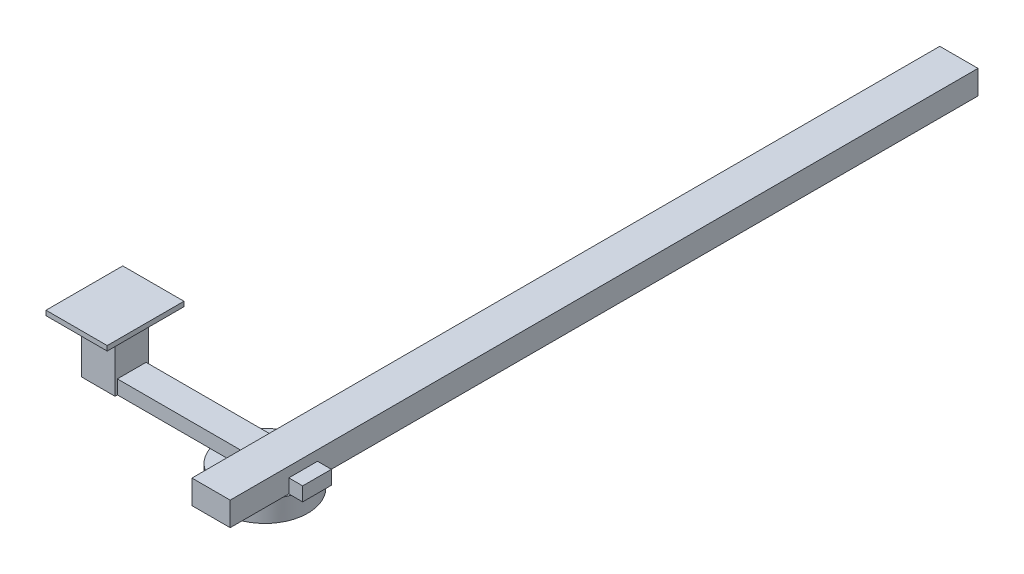
ISO-10303-21;
HEADER;
FILE_DESCRIPTION(('STEP AP214'),'2;1');
FILE_NAME('part.step','',(''),(''),'','','');
FILE_SCHEMA(('AUTOMOTIVE_DESIGN { 1 0 10303 214 1 1 1 1 }'));
ENDSEC;
DATA;
#1=APPLICATION_CONTEXT('core data for automotive mechanical design processes');
#2=APPLICATION_PROTOCOL_DEFINITION('international standard','automotive_design',2000,#1);
#3=PRODUCT_CONTEXT('',#1,'mechanical');
#4=PRODUCT('Part','Part','',(#3));
#5=PRODUCT_RELATED_PRODUCT_CATEGORY('part','',(#4));
#6=PRODUCT_DEFINITION_FORMATION('','',#4);
#7=PRODUCT_DEFINITION_CONTEXT('part definition',#1,'design');
#8=PRODUCT_DEFINITION('design','',#6,#7);
#9=PRODUCT_DEFINITION_SHAPE('','',#8);
#10=(LENGTH_UNIT() NAMED_UNIT(*) SI_UNIT(.MILLI.,.METRE.));
#11=(NAMED_UNIT(*) PLANE_ANGLE_UNIT() SI_UNIT($,.RADIAN.));
#12=(NAMED_UNIT(*) SI_UNIT($,.STERADIAN.) SOLID_ANGLE_UNIT());
#13=UNCERTAINTY_MEASURE_WITH_UNIT(LENGTH_MEASURE(1.E-05),#10,'distance_accuracy_value','');
#14=(GEOMETRIC_REPRESENTATION_CONTEXT(3) GLOBAL_UNCERTAINTY_ASSIGNED_CONTEXT((#13)) GLOBAL_UNIT_ASSIGNED_CONTEXT((#10,
#11,#12)) REPRESENTATION_CONTEXT('',''));
#15=CARTESIAN_POINT('',(0.,0.,0.));
#16=DIRECTION('',(0.,0.,1.));
#17=DIRECTION('',(1.,0.,0.));
#18=AXIS2_PLACEMENT_3D('',#15,#16,#17);
#19=CARTESIAN_POINT('',(0.,74.,0.));
#20=DIRECTION('',(0.,1.,0.));
#21=DIRECTION('',(-1.,0.,0.));
#22=AXIS2_PLACEMENT_3D('',#19,#20,#21);
#23=PLANE('',#22);
#24=DIRECTION('',(-1.,0.,0.));
#25=VECTOR('',#24,1.);
#26=CARTESIAN_POINT('',(-278.5,73.9999999999999,-30.));
#27=LINE('',#26,#25);
#28=CARTESIAN_POINT('',(0.,74.,-30.));
#29=VERTEX_POINT('',#28);
#30=CARTESIAN_POINT('',(-278.5,73.9999999999999,-30.));
#31=VERTEX_POINT('',#30);
#32=EDGE_CURVE('E305',#29,#31,#27,.T.);
#33=ORIENTED_EDGE('',*,*,#32,.T.);
#34=DIRECTION('',(0.,0.,1.));
#35=VECTOR('',#34,1.);
#36=CARTESIAN_POINT('',(-278.5,73.9999999999999,0.));
#37=LINE('',#36,#35);
#38=CARTESIAN_POINT('',(-278.5,73.9999999999999,30.));
#39=VERTEX_POINT('',#38);
#40=EDGE_CURVE('E11',#31,#39,#37,.T.);
#41=ORIENTED_EDGE('',*,*,#40,.T.);
#42=DIRECTION('',(1.,0.,0.));
#43=VECTOR('',#42,1.);
#44=CARTESIAN_POINT('',(-278.5,73.9999999999999,30.));
#45=LINE('',#44,#43);
#46=CARTESIAN_POINT('',(0.,74.,30.));
#47=VERTEX_POINT('',#46);
#48=EDGE_CURVE('E297',#39,#47,#45,.T.);
#49=ORIENTED_EDGE('',*,*,#48,.T.);
#50=DIRECTION('',(0.,0.,-1.));
#51=VECTOR('',#50,1.);
#52=CARTESIAN_POINT('',(0.,74.,-30.));
#53=LINE('',#52,#51);
#54=EDGE_CURVE('E301',#47,#29,#53,.T.);
#55=ORIENTED_EDGE('',*,*,#54,.T.);
#56=EDGE_LOOP('',(#33,#41,#49,#55));
#57=FACE_BOUND('',#56,.T.);
#58=ADVANCED_FACE('F39',(#57),#23,.T.);
#59=CARTESIAN_POINT('',(90.,45.,0.));
#60=DIRECTION('',(0.,-1.,0.));
#61=DIRECTION('',(1.,0.,0.));
#62=AXIS2_PLACEMENT_3D('',#59,#60,#61);
#63=PLANE('',#62);
#64=DIRECTION('',(-1.,0.,0.));
#65=VECTOR('',#64,1.);
#66=CARTESIAN_POINT('',(108.950738565978,45.,30.));
#67=LINE('',#66,#65);
#68=CARTESIAN_POINT('',(84.8528137423857,45.,30.));
#69=VERTEX_POINT('',#68);
#70=CARTESIAN_POINT('',(79.9507385659778,45.,30.));
#71=VERTEX_POINT('',#70);
#72=EDGE_CURVE('E289',#69,#71,#67,.T.);
#73=ORIENTED_EDGE('',*,*,#72,.T.);
#74=DIRECTION('',(0.,0.,-1.));
#75=VECTOR('',#74,1.);
#76=CARTESIAN_POINT('',(79.9507385659778,45.,-1411.12420449083));
#77=LINE('',#76,#75);
#78=CARTESIAN_POINT('',(79.9507385659778,45.,41.3264975863509));
#79=VERTEX_POINT('',#78);
#80=EDGE_CURVE('E396',#79,#71,#77,.T.);
#81=ORIENTED_EDGE('',*,*,#80,.F.);
#82=CARTESIAN_POINT('',(0.,45.,0.));
#83=DIRECTION('',(0.,1.,0.));
#84=DIRECTION('',(-1.,0.,0.));
#85=AXIS2_PLACEMENT_3D('',#82,#83,#84);
#86=CIRCLE('',#85,90.);
#87=EDGE_CURVE('E419',#79,#69,#86,.T.);
#88=ORIENTED_EDGE('',*,*,#87,.T.);
#89=EDGE_LOOP('',(#73,#81,#88));
#90=FACE_BOUND('',#89,.T.);
#91=ADVANCED_FACE('F501',(#90),#63,.F.);
#92=DIRECTION('',(-1.,0.,0.));
#93=VECTOR('',#92,1.);
#94=CARTESIAN_POINT('',(108.950738565978,45.,-30.));
#95=LINE('',#94,#93);
#96=CARTESIAN_POINT('',(84.8528137423857,45.,-30.));
#97=VERTEX_POINT('',#96);
#98=CARTESIAN_POINT('',(79.9507385659778,45.,-30.));
#99=VERTEX_POINT('',#98);
#100=EDGE_CURVE('E55',#97,#99,#95,.T.);
#101=ORIENTED_EDGE('',*,*,#100,.F.);
#102=CARTESIAN_POINT('',(79.9507385659778,45.,-41.3264975863508));
#103=VERTEX_POINT('',#102);
#104=EDGE_CURVE('E420',#97,#103,#86,.T.);
#105=ORIENTED_EDGE('',*,*,#104,.T.);
#106=EDGE_CURVE('E395',#99,#103,#77,.T.);
#107=ORIENTED_EDGE('',*,*,#106,.F.);
#108=EDGE_LOOP('',(#101,#105,#107));
#109=FACE_BOUND('',#108,.T.);
#110=ADVANCED_FACE('F527',(#109),#63,.F.);
#111=CARTESIAN_POINT('',(79.9507385659778,95.,-1411.12420449083));
#112=DIRECTION('',(-1.,0.,0.));
#113=DIRECTION('',(0.,-1.,0.));
#114=AXIS2_PLACEMENT_3D('',#111,#112,#113);
#115=PLANE('',#114);
#116=DIRECTION('',(0.,-1.,0.));
#117=VECTOR('',#116,1.);
#118=CARTESIAN_POINT('',(79.9507385659778,74.,30.));
#119=LINE('',#118,#117);
#120=CARTESIAN_POINT('',(79.9507385659778,74.,30.));
#121=VERTEX_POINT('',#120);
#122=EDGE_CURVE('E252',#121,#71,#119,.T.);
#123=ORIENTED_EDGE('',*,*,#122,.F.);
#124=DIRECTION('',(0.,0.,1.));
#125=VECTOR('',#124,1.);
#126=CARTESIAN_POINT('',(79.9507385659778,74.,30.));
#127=LINE('',#126,#125);
#128=CARTESIAN_POINT('',(79.9507385659778,74.,-30.));
#129=VERTEX_POINT('',#128);
#130=EDGE_CURVE('E258',#129,#121,#127,.T.);
#131=ORIENTED_EDGE('',*,*,#130,.F.);
#132=DIRECTION('',(0.,1.,0.));
#133=VECTOR('',#132,1.);
#134=CARTESIAN_POINT('',(79.9507385659778,74.,-30.));
#135=LINE('',#134,#133);
#136=EDGE_CURVE('E271',#99,#129,#135,.T.);
#137=ORIENTED_EDGE('',*,*,#136,.F.);
#138=ORIENTED_EDGE('',*,*,#106,.T.);
#139=CARTESIAN_POINT('',(79.9507385659778,45.,-1411.12420449083));
#140=VERTEX_POINT('',#139);
#141=EDGE_CURVE('E390',#103,#140,#77,.T.);
#142=ORIENTED_EDGE('',*,*,#141,.T.);
#143=DIRECTION('',(0.,-1.,0.));
#144=VECTOR('',#143,1.);
#145=CARTESIAN_POINT('',(79.9507385659778,95.,-1411.12420449083));
#146=LINE('',#145,#144);
#147=CARTESIAN_POINT('',(79.9507385659778,95.,-1411.12420449083));
#148=VERTEX_POINT('',#147);
#149=EDGE_CURVE('E402',#148,#140,#146,.T.);
#150=ORIENTED_EDGE('',*,*,#149,.F.);
#151=DIRECTION('',(0.,0.,-1.));
#152=VECTOR('',#151,1.);
#153=CARTESIAN_POINT('',(79.9507385659778,95.,-1411.12420449083));
#154=LINE('',#153,#152);
#155=CARTESIAN_POINT('',(79.9507385659778,95.,152.582043319577));
#156=VERTEX_POINT('',#155);
#157=EDGE_CURVE('E375',#156,#148,#154,.T.);
#158=ORIENTED_EDGE('',*,*,#157,.F.);
#159=DIRECTION('',(0.,-1.,0.));
#160=VECTOR('',#159,1.);
#161=CARTESIAN_POINT('',(79.9507385659778,95.,152.582043319577));
#162=LINE('',#161,#160);
#163=CARTESIAN_POINT('',(79.9507385659778,45.,152.582043319577));
#164=VERTEX_POINT('',#163);
#165=EDGE_CURVE('E406',#156,#164,#162,.T.);
#166=ORIENTED_EDGE('',*,*,#165,.T.);
#167=EDGE_CURVE('E391',#164,#79,#77,.T.);
#168=ORIENTED_EDGE('',*,*,#167,.T.);
#169=ORIENTED_EDGE('',*,*,#80,.T.);
#170=EDGE_LOOP('',(#123,#131,#137,#138,#142,#150,#158,#166,#168,#169));
#171=FACE_BOUND('',#170,.T.);
#172=ADVANCED_FACE('F434',(#171),#115,.F.);
#173=DIRECTION('',(1.,0.,0.));
#174=VECTOR('',#173,1.);
#175=CARTESIAN_POINT('',(-278.5,44.9999999999999,30.));
#176=LINE('',#175,#174);
#177=CARTESIAN_POINT('',(-84.8528137423857,45.,30.));
#178=VERTEX_POINT('',#177);
#179=CARTESIAN_POINT('',(0.,45.,30.));
#180=VERTEX_POINT('',#179);
#181=EDGE_CURVE('E317',#178,#180,#176,.T.);
#182=ORIENTED_EDGE('',*,*,#181,.F.);
#183=CARTESIAN_POINT('',(0.,45.,90.));
#184=VERTEX_POINT('',#183);
#185=EDGE_CURVE('E414',#178,#184,#86,.T.);
#186=ORIENTED_EDGE('',*,*,#185,.T.);
#187=DIRECTION('',(0.,0.,1.));
#188=VECTOR('',#187,1.);
#189=CARTESIAN_POINT('',(0.,45.,-1411.12420449083));
#190=LINE('',#189,#188);
#191=EDGE_CURVE('E387',#180,#184,#190,.T.);
#192=ORIENTED_EDGE('',*,*,#191,.F.);
#193=EDGE_LOOP('',(#182,#186,#192));
#194=FACE_BOUND('',#193,.T.);
#195=ADVANCED_FACE('F481',(#194),#63,.F.);
#196=DIRECTION('',(-1.,0.,0.));
#197=VECTOR('',#196,1.);
#198=CARTESIAN_POINT('',(-278.5,44.9999999999999,-30.));
#199=LINE('',#198,#197);
#200=CARTESIAN_POINT('',(0.,45.,-30.));
#201=VERTEX_POINT('',#200);
#202=CARTESIAN_POINT('',(-84.8528137423857,45.,-30.));
#203=VERTEX_POINT('',#202);
#204=EDGE_CURVE('E323',#201,#203,#199,.T.);
#205=ORIENTED_EDGE('',*,*,#204,.F.);
#206=CARTESIAN_POINT('',(0.,45.,-90.));
#207=VERTEX_POINT('',#206);
#208=EDGE_CURVE('E48',#207,#201,#190,.T.);
#209=ORIENTED_EDGE('',*,*,#208,.F.);
#210=EDGE_CURVE('E470',#207,#203,#86,.T.);
#211=ORIENTED_EDGE('',*,*,#210,.T.);
#212=EDGE_LOOP('',(#205,#209,#211));
#213=FACE_BOUND('',#212,.T.);
#214=ADVANCED_FACE('F571',(#213),#63,.F.);
#215=CARTESIAN_POINT('',(0.,95.,-1411.12420449083));
#216=DIRECTION('',(1.,0.,0.));
#217=DIRECTION('',(0.,1.,0.));
#218=AXIS2_PLACEMENT_3D('',#215,#216,#217);
#219=PLANE('',#218);
#220=DIRECTION('',(0.,-1.,0.));
#221=VECTOR('',#220,1.);
#222=CARTESIAN_POINT('',(0.,74.,30.));
#223=LINE('',#222,#221);
#224=EDGE_CURVE('E347',#47,#180,#223,.T.);
#225=ORIENTED_EDGE('',*,*,#224,.T.);
#226=ORIENTED_EDGE('',*,*,#191,.T.);
#227=CARTESIAN_POINT('',(0.,45.,152.582043319577));
#228=VERTEX_POINT('',#227);
#229=EDGE_CURVE('E366',#184,#228,#190,.T.);
#230=ORIENTED_EDGE('',*,*,#229,.T.);
#231=DIRECTION('',(0.,-1.,0.));
#232=VECTOR('',#231,1.);
#233=CARTESIAN_POINT('',(0.,95.,152.582043319577));
#234=LINE('',#233,#232);
#235=CARTESIAN_POINT('',(0.,95.,152.582043319577));
#236=VERTEX_POINT('',#235);
#237=EDGE_CURVE('E410',#236,#228,#234,.T.);
#238=ORIENTED_EDGE('',*,*,#237,.F.);
#239=DIRECTION('',(0.,0.,1.));
#240=VECTOR('',#239,1.);
#241=CARTESIAN_POINT('',(0.,95.,-1411.12420449083));
#242=LINE('',#241,#240);
#243=CARTESIAN_POINT('',(0.,95.,-1411.12420449083));
#244=VERTEX_POINT('',#243);
#245=EDGE_CURVE('E367',#244,#236,#242,.T.);
#246=ORIENTED_EDGE('',*,*,#245,.F.);
#247=DIRECTION('',(0.,-1.,0.));
#248=VECTOR('',#247,1.);
#249=CARTESIAN_POINT('',(0.,95.,-1411.12420449083));
#250=LINE('',#249,#248);
#251=CARTESIAN_POINT('',(0.,45.,-1411.12420449083));
#252=VERTEX_POINT('',#251);
#253=EDGE_CURVE('E381',#244,#252,#250,.T.);
#254=ORIENTED_EDGE('',*,*,#253,.T.);
#255=EDGE_CURVE('E382',#252,#207,#190,.T.);
#256=ORIENTED_EDGE('',*,*,#255,.T.);
#257=ORIENTED_EDGE('',*,*,#208,.T.);
#258=DIRECTION('',(0.,-1.,0.));
#259=VECTOR('',#258,1.);
#260=CARTESIAN_POINT('',(0.,74.,-30.));
#261=LINE('',#260,#259);
#262=EDGE_CURVE('E344',#29,#201,#261,.T.);
#263=ORIENTED_EDGE('',*,*,#262,.F.);
#264=ORIENTED_EDGE('',*,*,#54,.F.);
#265=EDGE_LOOP('',(#225,#226,#230,#238,#246,#254,#256,#257,#263,#264));
#266=FACE_BOUND('',#265,.T.);
#267=ADVANCED_FACE('F448',(#266),#219,.F.);
#268=CARTESIAN_POINT('',(0.,0.,0.));
#269=DIRECTION('',(0.,1.,0.));
#270=DIRECTION('',(-1.,0.,0.));
#271=AXIS2_PLACEMENT_3D('',#268,#269,#270);
#272=PLANE('',#271);
#273=CARTESIAN_POINT('',(0.,0.,0.));
#274=DIRECTION('',(0.,1.,0.));
#275=DIRECTION('',(-1.,0.,0.));
#276=AXIS2_PLACEMENT_3D('',#273,#274,#275);
#277=CIRCLE('',#276,90.);
#278=CARTESIAN_POINT('',(-90.,0.,0.));
#279=VERTEX_POINT('',#278);
#280=EDGE_CURVE('E418',#279,#279,#277,.T.);
#281=ORIENTED_EDGE('',*,*,#280,.F.);
#282=EDGE_LOOP('',(#281));
#283=FACE_BOUND('',#282,.T.);
#284=ADVANCED_FACE('F41',(#283),#272,.F.);
#285=CARTESIAN_POINT('',(0.,45.,0.));
#286=DIRECTION('',(0.,1.,0.));
#287=DIRECTION('',(-1.,0.,0.));
#288=AXIS2_PLACEMENT_3D('',#285,#286,#287);
#289=CYLINDRICAL_SURFACE('',#288,90.);
#290=EDGE_CURVE('E415',#184,#79,#86,.T.);
#291=ORIENTED_EDGE('',*,*,#290,.F.);
#292=ORIENTED_EDGE('',*,*,#185,.F.);
#293=CARTESIAN_POINT('',(0.,45.,0.));
#294=DIRECTION('',(0.,1.,0.));
#295=DIRECTION('',(-1.,0.,0.));
#296=AXIS2_PLACEMENT_3D('',#293,#294,#295);
#297=CIRCLE('',#296,90.);
#298=EDGE_CURVE('E363',#203,#178,#297,.T.);
#299=ORIENTED_EDGE('',*,*,#298,.F.);
#300=ORIENTED_EDGE('',*,*,#210,.F.);
#301=EDGE_CURVE('E445',#103,#207,#86,.T.);
#302=ORIENTED_EDGE('',*,*,#301,.F.);
#303=ORIENTED_EDGE('',*,*,#104,.F.);
#304=CARTESIAN_POINT('',(0.,45.,0.));
#305=DIRECTION('',(0.,1.,0.));
#306=DIRECTION('',(-1.,0.,0.));
#307=AXIS2_PLACEMENT_3D('',#304,#305,#306);
#308=CIRCLE('',#307,90.);
#309=EDGE_CURVE('E62',#69,#97,#308,.T.);
#310=ORIENTED_EDGE('',*,*,#309,.F.);
#311=ORIENTED_EDGE('',*,*,#87,.F.);
#312=EDGE_LOOP('',(#291,#292,#299,#300,#302,#303,#310,#311));
#313=FACE_BOUND('',#312,.T.);
#314=ORIENTED_EDGE('',*,*,#280,.T.);
#315=EDGE_LOOP('',(#314));
#316=FACE_BOUND('',#315,.T.);
#317=ADVANCED_FACE('F463',(#313,#316),#289,.T.);
#318=CARTESIAN_POINT('',(0.,45.,0.));
#319=DIRECTION('',(0.,1.,0.));
#320=DIRECTION('',(-1.,0.,0.));
#321=AXIS2_PLACEMENT_3D('',#318,#319,#320);
#322=PLANE('',#321);
#323=ORIENTED_EDGE('',*,*,#229,.F.);
#324=ORIENTED_EDGE('',*,*,#290,.T.);
#325=ORIENTED_EDGE('',*,*,#167,.F.);
#326=DIRECTION('',(1.,0.,0.));
#327=VECTOR('',#326,1.);
#328=CARTESIAN_POINT('',(0.,45.,152.582043319577));
#329=LINE('',#328,#327);
#330=EDGE_CURVE('E386',#228,#164,#329,.T.);
#331=ORIENTED_EDGE('',*,*,#330,.F.);
#332=EDGE_LOOP('',(#323,#324,#325,#331));
#333=FACE_BOUND('',#332,.T.);
#334=ADVANCED_FACE('F460',(#333),#322,.F.);
#335=ORIENTED_EDGE('',*,*,#141,.F.);
#336=ORIENTED_EDGE('',*,*,#301,.T.);
#337=ORIENTED_EDGE('',*,*,#255,.F.);
#338=DIRECTION('',(-1.,0.,0.));
#339=VECTOR('',#338,1.);
#340=CARTESIAN_POINT('',(0.,45.,-1411.12420449083));
#341=LINE('',#340,#339);
#342=EDGE_CURVE('E372',#140,#252,#341,.T.);
#343=ORIENTED_EDGE('',*,*,#342,.F.);
#344=EDGE_LOOP('',(#335,#336,#337,#343));
#345=FACE_BOUND('',#344,.T.);
#346=ADVANCED_FACE('F444',(#345),#322,.F.);
#347=CARTESIAN_POINT('',(0.,95.,152.582043319577));
#348=DIRECTION('',(0.,0.,-1.));
#349=DIRECTION('',(-1.,0.,0.));
#350=AXIS2_PLACEMENT_3D('',#347,#348,#349);
#351=PLANE('',#350);
#352=ORIENTED_EDGE('',*,*,#330,.T.);
#353=ORIENTED_EDGE('',*,*,#165,.F.);
#354=DIRECTION('',(1.,0.,0.));
#355=VECTOR('',#354,1.);
#356=CARTESIAN_POINT('',(0.,95.,152.582043319577));
#357=LINE('',#356,#355);
#358=EDGE_CURVE('E371',#236,#156,#357,.T.);
#359=ORIENTED_EDGE('',*,*,#358,.F.);
#360=ORIENTED_EDGE('',*,*,#237,.T.);
#361=EDGE_LOOP('',(#352,#353,#359,#360));
#362=FACE_BOUND('',#361,.T.);
#363=ADVANCED_FACE('F566',(#362),#351,.F.);
#364=CARTESIAN_POINT('',(0.,95.,-1411.12420449083));
#365=DIRECTION('',(0.,0.,1.));
#366=DIRECTION('',(1.,0.,0.));
#367=AXIS2_PLACEMENT_3D('',#364,#365,#366);
#368=PLANE('',#367);
#369=ORIENTED_EDGE('',*,*,#342,.T.);
#370=ORIENTED_EDGE('',*,*,#253,.F.);
#371=DIRECTION('',(-1.,0.,0.));
#372=VECTOR('',#371,1.);
#373=CARTESIAN_POINT('',(0.,95.,-1411.12420449083));
#374=LINE('',#373,#372);
#375=EDGE_CURVE('E378',#148,#244,#374,.T.);
#376=ORIENTED_EDGE('',*,*,#375,.F.);
#377=ORIENTED_EDGE('',*,*,#149,.T.);
#378=EDGE_LOOP('',(#369,#370,#376,#377));
#379=FACE_BOUND('',#378,.T.);
#380=ADVANCED_FACE('F441',(#379),#368,.F.);
#381=CARTESIAN_POINT('',(0.,95.,0.));
#382=DIRECTION('',(0.,1.,0.));
#383=DIRECTION('',(-1.,0.,0.));
#384=AXIS2_PLACEMENT_3D('',#381,#382,#383);
#385=PLANE('',#384);
#386=ORIENTED_EDGE('',*,*,#245,.T.);
#387=ORIENTED_EDGE('',*,*,#358,.T.);
#388=ORIENTED_EDGE('',*,*,#157,.T.);
#389=ORIENTED_EDGE('',*,*,#375,.T.);
#390=EDGE_LOOP('',(#386,#387,#388,#389));
#391=FACE_BOUND('',#390,.T.);
#392=ADVANCED_FACE('F453',(#391),#385,.T.);
#393=CARTESIAN_POINT('',(0.,45.,0.));
#394=DIRECTION('',(0.,1.,0.));
#395=DIRECTION('',(-1.,0.,0.));
#396=AXIS2_PLACEMENT_3D('',#393,#394,#395);
#397=PLANE('',#396);
#398=CARTESIAN_POINT('',(-278.5,44.9999999999999,-30.));
#399=VERTEX_POINT('',#398);
#400=EDGE_CURVE('E322',#203,#399,#199,.T.);
#401=ORIENTED_EDGE('',*,*,#400,.F.);
#402=ORIENTED_EDGE('',*,*,#298,.T.);
#403=CARTESIAN_POINT('',(-278.5,44.9999999999999,30.));
#404=VERTEX_POINT('',#403);
#405=EDGE_CURVE('E318',#404,#178,#176,.T.);
#406=ORIENTED_EDGE('',*,*,#405,.F.);
#407=DIRECTION('',(0.,0.,-1.));
#408=VECTOR('',#407,1.);
#409=CARTESIAN_POINT('',(-278.5,44.9999999999999,35.));
#410=LINE('',#409,#408);
#411=CARTESIAN_POINT('',(-278.5,44.9999999999999,35.));
#412=VERTEX_POINT('',#411);
#413=EDGE_CURVE('E314',#412,#404,#410,.T.);
#414=ORIENTED_EDGE('',*,*,#413,.F.);
#415=DIRECTION('',(1.,0.,0.));
#416=VECTOR('',#415,1.);
#417=CARTESIAN_POINT('',(-348.5,44.9999999999999,35.));
#418=LINE('',#417,#416);
#419=CARTESIAN_POINT('',(-348.5,44.9999999999999,35.));
#420=VERTEX_POINT('',#419);
#421=EDGE_CURVE('E311',#420,#412,#418,.T.);
#422=ORIENTED_EDGE('',*,*,#421,.F.);
#423=DIRECTION('',(0.,0.,1.));
#424=VECTOR('',#423,1.);
#425=CARTESIAN_POINT('',(-348.5,44.9999999999999,30.));
#426=LINE('',#425,#424);
#427=CARTESIAN_POINT('',(-348.5,44.9999999999999,-35.));
#428=VERTEX_POINT('',#427);
#429=EDGE_CURVE('E296',#428,#420,#426,.T.);
#430=ORIENTED_EDGE('',*,*,#429,.F.);
#431=DIRECTION('',(-1.,0.,0.));
#432=VECTOR('',#431,1.);
#433=CARTESIAN_POINT('',(-348.5,44.9999999999999,-35.));
#434=LINE('',#433,#432);
#435=CARTESIAN_POINT('',(-278.5,44.9999999999999,-35.));
#436=VERTEX_POINT('',#435);
#437=EDGE_CURVE('E302',#436,#428,#434,.T.);
#438=ORIENTED_EDGE('',*,*,#437,.F.);
#439=DIRECTION('',(0.,0.,-1.));
#440=VECTOR('',#439,1.);
#441=CARTESIAN_POINT('',(-278.5,44.9999999999999,-35.));
#442=LINE('',#441,#440);
#443=EDGE_CURVE('E327',#399,#436,#442,.T.);
#444=ORIENTED_EDGE('',*,*,#443,.F.);
#445=EDGE_LOOP('',(#401,#402,#406,#414,#422,#430,#438,#444));
#446=FACE_BOUND('',#445,.T.);
#447=ADVANCED_FACE('F532',(#446),#397,.F.);
#448=CARTESIAN_POINT('',(-348.5,73.9999999999999,30.));
#449=DIRECTION('',(1.,0.,0.));
#450=DIRECTION('',(0.,1.,0.));
#451=AXIS2_PLACEMENT_3D('',#448,#449,#450);
#452=PLANE('',#451);
#453=ORIENTED_EDGE('',*,*,#429,.T.);
#454=DIRECTION('',(0.,-1.,0.));
#455=VECTOR('',#454,1.);
#456=CARTESIAN_POINT('',(-348.5,73.9999999999999,35.));
#457=LINE('',#456,#455);
#458=CARTESIAN_POINT('',(-348.5,164.,35.));
#459=VERTEX_POINT('',#458);
#460=EDGE_CURVE('E359',#459,#420,#457,.T.);
#461=ORIENTED_EDGE('',*,*,#460,.F.);
#462=DIRECTION('',(0.,0.,1.));
#463=VECTOR('',#462,1.);
#464=CARTESIAN_POINT('',(-348.5,164.,-35.));
#465=LINE('',#464,#463);
#466=CARTESIAN_POINT('',(-348.5,164.,-35.));
#467=VERTEX_POINT('',#466);
#468=EDGE_CURVE('E230',#467,#459,#465,.T.);
#469=ORIENTED_EDGE('',*,*,#468,.F.);
#470=DIRECTION('',(0.,-1.,0.));
#471=VECTOR('',#470,1.);
#472=CARTESIAN_POINT('',(-348.5,73.9999999999999,-35.));
#473=LINE('',#472,#471);
#474=EDGE_CURVE('E308',#467,#428,#473,.T.);
#475=ORIENTED_EDGE('',*,*,#474,.T.);
#476=EDGE_LOOP('',(#453,#461,#469,#475));
#477=FACE_BOUND('',#476,.T.);
#478=ADVANCED_FACE('F535',(#477),#452,.F.);
#479=CARTESIAN_POINT('',(-348.5,73.9999999999999,35.));
#480=DIRECTION('',(0.,0.,-1.));
#481=DIRECTION('',(-1.,0.,0.));
#482=AXIS2_PLACEMENT_3D('',#479,#480,#481);
#483=PLANE('',#482);
#484=ORIENTED_EDGE('',*,*,#421,.T.);
#485=DIRECTION('',(0.,-1.,0.));
#486=VECTOR('',#485,1.);
#487=CARTESIAN_POINT('',(-278.5,73.9999999999999,35.));
#488=LINE('',#487,#486);
#489=CARTESIAN_POINT('',(-278.5,164.,35.));
#490=VERTEX_POINT('',#489);
#491=EDGE_CURVE('E355',#490,#412,#488,.T.);
#492=ORIENTED_EDGE('',*,*,#491,.F.);
#493=DIRECTION('',(1.,0.,0.));
#494=VECTOR('',#493,1.);
#495=CARTESIAN_POINT('',(-348.5,164.,35.));
#496=LINE('',#495,#494);
#497=EDGE_CURVE('E235',#459,#490,#496,.T.);
#498=ORIENTED_EDGE('',*,*,#497,.F.);
#499=ORIENTED_EDGE('',*,*,#460,.T.);
#500=EDGE_LOOP('',(#484,#492,#498,#499));
#501=FACE_BOUND('',#500,.T.);
#502=ADVANCED_FACE('F552',(#501),#483,.F.);
#503=CARTESIAN_POINT('',(-278.5,73.9999999999999,35.));
#504=DIRECTION('',(-1.,0.,0.));
#505=DIRECTION('',(0.,-1.,0.));
#506=AXIS2_PLACEMENT_3D('',#503,#504,#505);
#507=PLANE('',#506);
#508=ORIENTED_EDGE('',*,*,#413,.T.);
#509=DIRECTION('',(0.,-1.,0.));
#510=VECTOR('',#509,1.);
#511=CARTESIAN_POINT('',(-278.5,73.9999999999999,30.));
#512=LINE('',#511,#510);
#513=EDGE_CURVE('E351',#39,#404,#512,.T.);
#514=ORIENTED_EDGE('',*,*,#513,.F.);
#515=ORIENTED_EDGE('',*,*,#40,.F.);
#516=DIRECTION('',(0.,-1.,0.));
#517=VECTOR('',#516,1.);
#518=CARTESIAN_POINT('',(-278.5,73.9999999999999,-30.));
#519=LINE('',#518,#517);
#520=EDGE_CURVE('E340',#31,#399,#519,.T.);
#521=ORIENTED_EDGE('',*,*,#520,.T.);
#522=ORIENTED_EDGE('',*,*,#443,.T.);
#523=DIRECTION('',(0.,-1.,0.));
#524=VECTOR('',#523,1.);
#525=CARTESIAN_POINT('',(-278.5,73.9999999999999,-35.));
#526=LINE('',#525,#524);
#527=CARTESIAN_POINT('',(-278.5,164.,-35.));
#528=VERTEX_POINT('',#527);
#529=EDGE_CURVE('E336',#528,#436,#526,.T.);
#530=ORIENTED_EDGE('',*,*,#529,.F.);
#531=DIRECTION('',(0.,0.,-1.));
#532=VECTOR('',#531,1.);
#533=CARTESIAN_POINT('',(-278.5,164.,35.));
#534=LINE('',#533,#532);
#535=EDGE_CURVE('E244',#490,#528,#534,.T.);
#536=ORIENTED_EDGE('',*,*,#535,.F.);
#537=ORIENTED_EDGE('',*,*,#491,.T.);
#538=EDGE_LOOP('',(#508,#514,#515,#521,#522,#530,#536,#537));
#539=FACE_BOUND('',#538,.T.);
#540=ADVANCED_FACE('F548',(#539),#507,.F.);
#541=CARTESIAN_POINT('',(-278.5,73.9999999999999,30.));
#542=DIRECTION('',(0.,0.,-1.));
#543=DIRECTION('',(-1.,0.,0.));
#544=AXIS2_PLACEMENT_3D('',#541,#542,#543);
#545=PLANE('',#544);
#546=ORIENTED_EDGE('',*,*,#405,.T.);
#547=ORIENTED_EDGE('',*,*,#181,.T.);
#548=ORIENTED_EDGE('',*,*,#224,.F.);
#549=ORIENTED_EDGE('',*,*,#48,.F.);
#550=ORIENTED_EDGE('',*,*,#513,.T.);
#551=EDGE_LOOP('',(#546,#547,#548,#549,#550));
#552=FACE_BOUND('',#551,.T.);
#553=ADVANCED_FACE('F544',(#552),#545,.F.);
#554=CARTESIAN_POINT('',(-278.5,73.9999999999999,-30.));
#555=DIRECTION('',(0.,0.,1.));
#556=DIRECTION('',(1.,0.,0.));
#557=AXIS2_PLACEMENT_3D('',#554,#555,#556);
#558=PLANE('',#557);
#559=ORIENTED_EDGE('',*,*,#204,.T.);
#560=ORIENTED_EDGE('',*,*,#400,.T.);
#561=ORIENTED_EDGE('',*,*,#520,.F.);
#562=ORIENTED_EDGE('',*,*,#32,.F.);
#563=ORIENTED_EDGE('',*,*,#262,.T.);
#564=EDGE_LOOP('',(#559,#560,#561,#562,#563));
#565=FACE_BOUND('',#564,.T.);
#566=ADVANCED_FACE('F540',(#565),#558,.F.);
#567=CARTESIAN_POINT('',(-348.5,73.9999999999999,-35.));
#568=DIRECTION('',(0.,0.,1.));
#569=DIRECTION('',(1.,0.,0.));
#570=AXIS2_PLACEMENT_3D('',#567,#568,#569);
#571=PLANE('',#570);
#572=ORIENTED_EDGE('',*,*,#437,.T.);
#573=ORIENTED_EDGE('',*,*,#474,.F.);
#574=DIRECTION('',(-1.,0.,0.));
#575=VECTOR('',#574,1.);
#576=CARTESIAN_POINT('',(-348.5,164.,-35.));
#577=LINE('',#576,#575);
#578=EDGE_CURVE('E248',#528,#467,#577,.T.);
#579=ORIENTED_EDGE('',*,*,#578,.F.);
#580=ORIENTED_EDGE('',*,*,#529,.T.);
#581=EDGE_LOOP('',(#572,#573,#579,#580));
#582=FACE_BOUND('',#581,.T.);
#583=ADVANCED_FACE('F537',(#582),#571,.F.);
#584=CARTESIAN_POINT('',(108.950738565978,45.,30.));
#585=DIRECTION('',(0.,1.,0.));
#586=DIRECTION('',(-1.,0.,0.));
#587=AXIS2_PLACEMENT_3D('',#584,#585,#586);
#588=PLANE('',#587);
#589=CARTESIAN_POINT('',(108.950738565978,45.,30.));
#590=VERTEX_POINT('',#589);
#591=EDGE_CURVE('E290',#590,#69,#67,.T.);
#592=ORIENTED_EDGE('',*,*,#591,.T.);
#593=ORIENTED_EDGE('',*,*,#309,.T.);
#594=CARTESIAN_POINT('',(108.950738565978,45.,-30.));
#595=VERTEX_POINT('',#594);
#596=EDGE_CURVE('E285',#595,#97,#95,.T.);
#597=ORIENTED_EDGE('',*,*,#596,.F.);
#598=DIRECTION('',(0.,0.,-1.));
#599=VECTOR('',#598,1.);
#600=CARTESIAN_POINT('',(108.950738565978,45.,30.));
#601=LINE('',#600,#599);
#602=EDGE_CURVE('E257',#590,#595,#601,.T.);
#603=ORIENTED_EDGE('',*,*,#602,.F.);
#604=EDGE_LOOP('',(#592,#593,#597,#603));
#605=FACE_BOUND('',#604,.T.);
#606=ADVANCED_FACE('F496',(#605),#588,.F.);
#607=CARTESIAN_POINT('',(108.950738565978,74.,30.));
#608=DIRECTION('',(0.,0.,-1.));
#609=DIRECTION('',(0.,1.,0.));
#610=AXIS2_PLACEMENT_3D('',#607,#608,#609);
#611=PLANE('',#610);
#612=ORIENTED_EDGE('',*,*,#122,.T.);
#613=ORIENTED_EDGE('',*,*,#72,.F.);
#614=ORIENTED_EDGE('',*,*,#591,.F.);
#615=DIRECTION('',(0.,-1.,0.));
#616=VECTOR('',#615,1.);
#617=CARTESIAN_POINT('',(108.950738565978,74.,30.));
#618=LINE('',#617,#616);
#619=CARTESIAN_POINT('',(108.950738565978,74.,30.));
#620=VERTEX_POINT('',#619);
#621=EDGE_CURVE('E253',#620,#590,#618,.T.);
#622=ORIENTED_EDGE('',*,*,#621,.F.);
#623=DIRECTION('',(-1.,0.,0.));
#624=VECTOR('',#623,1.);
#625=CARTESIAN_POINT('',(108.950738565978,74.,30.));
#626=LINE('',#625,#624);
#627=EDGE_CURVE('E267',#620,#121,#626,.T.);
#628=ORIENTED_EDGE('',*,*,#627,.T.);
#629=EDGE_LOOP('',(#612,#613,#614,#622,#628));
#630=FACE_BOUND('',#629,.T.);
#631=ADVANCED_FACE('F500',(#630),#611,.F.);
#632=CARTESIAN_POINT('',(108.950738565978,74.,-30.));
#633=DIRECTION('',(0.,0.,1.));
#634=DIRECTION('',(1.,0.,0.));
#635=AXIS2_PLACEMENT_3D('',#632,#633,#634);
#636=PLANE('',#635);
#637=ORIENTED_EDGE('',*,*,#136,.T.);
#638=DIRECTION('',(-1.,0.,0.));
#639=VECTOR('',#638,1.);
#640=CARTESIAN_POINT('',(108.950738565978,74.,-30.));
#641=LINE('',#640,#639);
#642=CARTESIAN_POINT('',(108.950738565978,74.,-30.));
#643=VERTEX_POINT('',#642);
#644=EDGE_CURVE('E281',#643,#129,#641,.T.);
#645=ORIENTED_EDGE('',*,*,#644,.F.);
#646=DIRECTION('',(0.,1.,0.));
#647=VECTOR('',#646,1.);
#648=CARTESIAN_POINT('',(108.950738565978,74.,-30.));
#649=LINE('',#648,#647);
#650=EDGE_CURVE('E261',#595,#643,#649,.T.);
#651=ORIENTED_EDGE('',*,*,#650,.F.);
#652=ORIENTED_EDGE('',*,*,#596,.T.);
#653=ORIENTED_EDGE('',*,*,#100,.T.);
#654=EDGE_LOOP('',(#637,#645,#651,#652,#653));
#655=FACE_BOUND('',#654,.T.);
#656=ADVANCED_FACE('F491',(#655),#636,.F.);
#657=CARTESIAN_POINT('',(108.950738565978,74.,30.));
#658=DIRECTION('',(0.,-1.,0.));
#659=DIRECTION('',(1.,0.,0.));
#660=AXIS2_PLACEMENT_3D('',#657,#658,#659);
#661=PLANE('',#660);
#662=ORIENTED_EDGE('',*,*,#130,.T.);
#663=ORIENTED_EDGE('',*,*,#627,.F.);
#664=DIRECTION('',(0.,0.,1.));
#665=VECTOR('',#664,1.);
#666=CARTESIAN_POINT('',(108.950738565978,74.,30.));
#667=LINE('',#666,#665);
#668=EDGE_CURVE('E264',#643,#620,#667,.T.);
#669=ORIENTED_EDGE('',*,*,#668,.F.);
#670=ORIENTED_EDGE('',*,*,#644,.T.);
#671=EDGE_LOOP('',(#662,#663,#669,#670));
#672=FACE_BOUND('',#671,.T.);
#673=ADVANCED_FACE('F504',(#672),#661,.F.);
#674=CARTESIAN_POINT('',(108.950738565978,0.,0.));
#675=DIRECTION('',(1.,0.,0.));
#676=DIRECTION('',(0.,1.,0.));
#677=AXIS2_PLACEMENT_3D('',#674,#675,#676);
#678=PLANE('',#677);
#679=ORIENTED_EDGE('',*,*,#621,.T.);
#680=ORIENTED_EDGE('',*,*,#602,.T.);
#681=ORIENTED_EDGE('',*,*,#650,.T.);
#682=ORIENTED_EDGE('',*,*,#668,.T.);
#683=EDGE_LOOP('',(#679,#680,#681,#682));
#684=FACE_BOUND('',#683,.T.);
#685=ADVANCED_FACE('F507',(#684),#678,.T.);
#686=CARTESIAN_POINT('',(0.,164.,0.));
#687=DIRECTION('',(0.,1.,0.));
#688=DIRECTION('',(-1.,0.,0.));
#689=AXIS2_PLACEMENT_3D('',#686,#687,#688);
#690=PLANE('',#689);
#691=DIRECTION('',(0.,0.,1.));
#692=VECTOR('',#691,1.);
#693=CARTESIAN_POINT('',(-377.5,164.,-80.25));
#694=LINE('',#693,#692);
#695=CARTESIAN_POINT('',(-377.5,164.,-80.25));
#696=VERTEX_POINT('',#695);
#697=CARTESIAN_POINT('',(-377.5,164.,80.25));
#698=VERTEX_POINT('',#697);
#699=EDGE_CURVE('E228',#696,#698,#694,.T.);
#700=ORIENTED_EDGE('',*,*,#699,.F.);
#701=DIRECTION('',(-1.,0.,0.));
#702=VECTOR('',#701,1.);
#703=CARTESIAN_POINT('',(-377.5,164.,-80.25));
#704=LINE('',#703,#702);
#705=CARTESIAN_POINT('',(-249.5,164.,-80.25));
#706=VERTEX_POINT('',#705);
#707=EDGE_CURVE('E224',#706,#696,#704,.T.);
#708=ORIENTED_EDGE('',*,*,#707,.F.);
#709=DIRECTION('',(0.,0.,-1.));
#710=VECTOR('',#709,1.);
#711=CARTESIAN_POINT('',(-249.5,164.,-80.25));
#712=LINE('',#711,#710);
#713=CARTESIAN_POINT('',(-249.5,164.,80.25));
#714=VERTEX_POINT('',#713);
#715=EDGE_CURVE('E776',#714,#706,#712,.T.);
#716=ORIENTED_EDGE('',*,*,#715,.F.);
#717=DIRECTION('',(1.,0.,0.));
#718=VECTOR('',#717,1.);
#719=CARTESIAN_POINT('',(-377.5,164.,80.25));
#720=LINE('',#719,#718);
#721=EDGE_CURVE('E781',#698,#714,#720,.T.);
#722=ORIENTED_EDGE('',*,*,#721,.F.);
#723=EDGE_LOOP('',(#700,#708,#716,#722));
#724=FACE_BOUND('',#723,.T.);
#725=ORIENTED_EDGE('',*,*,#578,.T.);
#726=ORIENTED_EDGE('',*,*,#468,.T.);
#727=ORIENTED_EDGE('',*,*,#497,.T.);
#728=ORIENTED_EDGE('',*,*,#535,.T.);
#729=EDGE_LOOP('',(#725,#726,#727,#728));
#730=FACE_BOUND('',#729,.T.);
#731=ADVANCED_FACE('F509',(#724,#730),#690,.F.);
#732=CARTESIAN_POINT('',(-377.5,174.,-80.25));
#733=DIRECTION('',(1.,0.,0.));
#734=DIRECTION('',(0.,1.,0.));
#735=AXIS2_PLACEMENT_3D('',#732,#733,#734);
#736=PLANE('',#735);
#737=ORIENTED_EDGE('',*,*,#699,.T.);
#738=DIRECTION('',(0.,-1.,0.));
#739=VECTOR('',#738,1.);
#740=CARTESIAN_POINT('',(-377.5,174.,80.25));
#741=LINE('',#740,#739);
#742=CARTESIAN_POINT('',(-377.5,174.,80.25));
#743=VERTEX_POINT('',#742);
#744=EDGE_CURVE('E206',#743,#698,#741,.T.);
#745=ORIENTED_EDGE('',*,*,#744,.F.);
#746=DIRECTION('',(0.,0.,1.));
#747=VECTOR('',#746,1.);
#748=CARTESIAN_POINT('',(-377.5,174.,-80.25));
#749=LINE('',#748,#747);
#750=CARTESIAN_POINT('',(-377.5,174.,-80.25));
#751=VERTEX_POINT('',#750);
#752=EDGE_CURVE('E214',#751,#743,#749,.T.);
#753=ORIENTED_EDGE('',*,*,#752,.F.);
#754=DIRECTION('',(0.,-1.,0.));
#755=VECTOR('',#754,1.);
#756=CARTESIAN_POINT('',(-377.5,174.,-80.25));
#757=LINE('',#756,#755);
#758=EDGE_CURVE('E772',#751,#696,#757,.T.);
#759=ORIENTED_EDGE('',*,*,#758,.T.);
#760=EDGE_LOOP('',(#737,#745,#753,#759));
#761=FACE_BOUND('',#760,.T.);
#762=ADVANCED_FACE('F226',(#761),#736,.F.);
#763=CARTESIAN_POINT('',(-377.5,174.,80.25));
#764=DIRECTION('',(0.,0.,-1.));
#765=DIRECTION('',(-1.,0.,0.));
#766=AXIS2_PLACEMENT_3D('',#763,#764,#765);
#767=PLANE('',#766);
#768=ORIENTED_EDGE('',*,*,#721,.T.);
#769=DIRECTION('',(0.,-1.,0.));
#770=VECTOR('',#769,1.);
#771=CARTESIAN_POINT('',(-249.5,174.,80.25));
#772=LINE('',#771,#770);
#773=CARTESIAN_POINT('',(-249.5,174.,80.25));
#774=VERTEX_POINT('',#773);
#775=EDGE_CURVE('E209',#774,#714,#772,.T.);
#776=ORIENTED_EDGE('',*,*,#775,.F.);
#777=DIRECTION('',(1.,0.,0.));
#778=VECTOR('',#777,1.);
#779=CARTESIAN_POINT('',(-377.5,174.,80.25));
#780=LINE('',#779,#778);
#781=EDGE_CURVE('E202',#743,#774,#780,.T.);
#782=ORIENTED_EDGE('',*,*,#781,.F.);
#783=ORIENTED_EDGE('',*,*,#744,.T.);
#784=EDGE_LOOP('',(#768,#776,#782,#783));
#785=FACE_BOUND('',#784,.T.);
#786=ADVANCED_FACE('F204',(#785),#767,.F.);
#787=CARTESIAN_POINT('',(-249.5,174.,-80.25));
#788=DIRECTION('',(-1.,0.,0.));
#789=DIRECTION('',(0.,-1.,0.));
#790=AXIS2_PLACEMENT_3D('',#787,#788,#789);
#791=PLANE('',#790);
#792=ORIENTED_EDGE('',*,*,#715,.T.);
#793=DIRECTION('',(0.,-1.,0.));
#794=VECTOR('',#793,1.);
#795=CARTESIAN_POINT('',(-249.5,174.,-80.25));
#796=LINE('',#795,#794);
#797=CARTESIAN_POINT('',(-249.5,174.,-80.25));
#798=VERTEX_POINT('',#797);
#799=EDGE_CURVE('E237',#798,#706,#796,.T.);
#800=ORIENTED_EDGE('',*,*,#799,.F.);
#801=DIRECTION('',(0.,0.,-1.));
#802=VECTOR('',#801,1.);
#803=CARTESIAN_POINT('',(-249.5,174.,-80.25));
#804=LINE('',#803,#802);
#805=EDGE_CURVE('E213',#774,#798,#804,.T.);
#806=ORIENTED_EDGE('',*,*,#805,.F.);
#807=ORIENTED_EDGE('',*,*,#775,.T.);
#808=EDGE_LOOP('',(#792,#800,#806,#807));
#809=FACE_BOUND('',#808,.T.);
#810=ADVANCED_FACE('F739',(#809),#791,.F.);
#811=CARTESIAN_POINT('',(-377.5,174.,-80.25));
#812=DIRECTION('',(0.,0.,1.));
#813=DIRECTION('',(1.,0.,0.));
#814=AXIS2_PLACEMENT_3D('',#811,#812,#813);
#815=PLANE('',#814);
#816=ORIENTED_EDGE('',*,*,#707,.T.);
#817=ORIENTED_EDGE('',*,*,#758,.F.);
#818=DIRECTION('',(-1.,0.,0.));
#819=VECTOR('',#818,1.);
#820=CARTESIAN_POINT('',(-377.5,174.,-80.25));
#821=LINE('',#820,#819);
#822=EDGE_CURVE('E219',#798,#751,#821,.T.);
#823=ORIENTED_EDGE('',*,*,#822,.F.);
#824=ORIENTED_EDGE('',*,*,#799,.T.);
#825=EDGE_LOOP('',(#816,#817,#823,#824));
#826=FACE_BOUND('',#825,.T.);
#827=ADVANCED_FACE('F748',(#826),#815,.F.);
#828=CARTESIAN_POINT('',(0.,174.,0.));
#829=DIRECTION('',(0.,1.,0.));
#830=DIRECTION('',(-1.,0.,0.));
#831=AXIS2_PLACEMENT_3D('',#828,#829,#830);
#832=PLANE('',#831);
#833=ORIENTED_EDGE('',*,*,#752,.T.);
#834=ORIENTED_EDGE('',*,*,#781,.T.);
#835=ORIENTED_EDGE('',*,*,#805,.T.);
#836=ORIENTED_EDGE('',*,*,#822,.T.);
#837=EDGE_LOOP('',(#833,#834,#835,#836));
#838=FACE_BOUND('',#837,.T.);
#839=ADVANCED_FACE('F217',(#838),#832,.T.);
#840=CLOSED_SHELL('',(#58,#91,#110,#172,#195,#214,#267,#284,#317,#334,#346,#363,#380,#392,#447,
#478,#502,#540,#553,#566,#583,#606,#631,#656,#673,#685,#731,#762,#786,#810,#827,#839));
#841=MANIFOLD_SOLID_BREP('B2',#840);
#842=ADVANCED_BREP_SHAPE_REPRESENTATION('',(#18,#841),#14);
#843=SHAPE_DEFINITION_REPRESENTATION(#9,#842);
ENDSEC;
END-ISO-10303-21;
